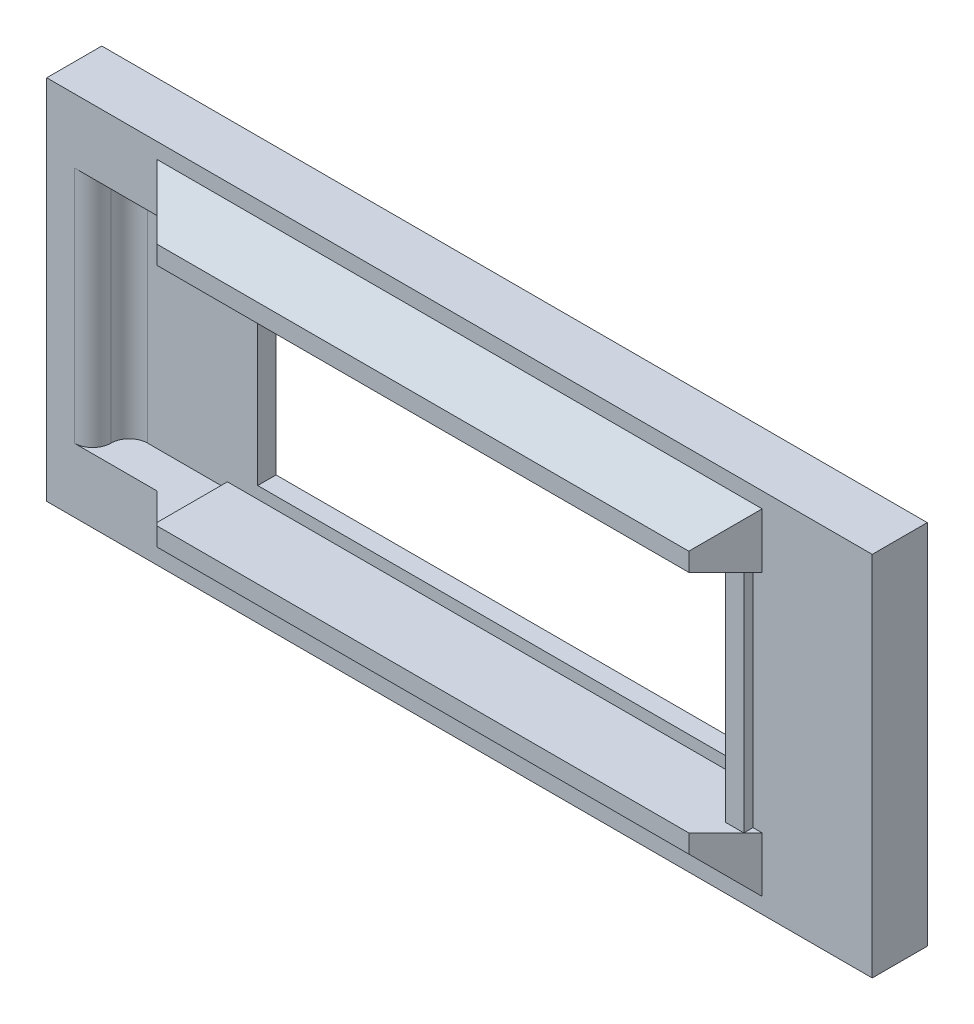
ISO-10303-21;
HEADER;
FILE_DESCRIPTION(('STEP AP214'),'2;1');
FILE_NAME('part.step','',(''),(''),'','','');
FILE_SCHEMA(('AUTOMOTIVE_DESIGN { 1 0 10303 214 1 1 1 1 }'));
ENDSEC;
DATA;
#1=APPLICATION_CONTEXT('core data for automotive mechanical design processes');
#2=APPLICATION_PROTOCOL_DEFINITION('international standard','automotive_design',2000,#1);
#3=PRODUCT_CONTEXT('',#1,'mechanical');
#4=PRODUCT('Part','Part','',(#3));
#5=PRODUCT_RELATED_PRODUCT_CATEGORY('part','',(#4));
#6=PRODUCT_DEFINITION_FORMATION('','',#4);
#7=PRODUCT_DEFINITION_CONTEXT('part definition',#1,'design');
#8=PRODUCT_DEFINITION('design','',#6,#7);
#9=PRODUCT_DEFINITION_SHAPE('','',#8);
#10=(LENGTH_UNIT() NAMED_UNIT(*) SI_UNIT(.MILLI.,.METRE.));
#11=(NAMED_UNIT(*) PLANE_ANGLE_UNIT() SI_UNIT($,.RADIAN.));
#12=(NAMED_UNIT(*) SI_UNIT($,.STERADIAN.) SOLID_ANGLE_UNIT());
#13=UNCERTAINTY_MEASURE_WITH_UNIT(LENGTH_MEASURE(1.E-05),#10,'distance_accuracy_value','');
#14=(GEOMETRIC_REPRESENTATION_CONTEXT(3) GLOBAL_UNCERTAINTY_ASSIGNED_CONTEXT((#13)) GLOBAL_UNIT_ASSIGNED_CONTEXT((#10,
#11,#12)) REPRESENTATION_CONTEXT('',''));
#15=CARTESIAN_POINT('',(0.,0.,0.));
#16=DIRECTION('',(0.,0.,1.));
#17=DIRECTION('',(1.,0.,0.));
#18=AXIS2_PLACEMENT_3D('',#15,#16,#17);
#19=CARTESIAN_POINT('',(-14.5,6.15,5.));
#20=DIRECTION('',(0.,1.,0.));
#21=DIRECTION('',(0.,0.,1.));
#22=AXIS2_PLACEMENT_3D('',#19,#20,#21);
#23=PLANE('',#22);
#24=DIRECTION('',(0.,0.,-1.));
#25=VECTOR('',#24,1.);
#26=CARTESIAN_POINT('',(15.,6.15,5.));
#27=LINE('',#26,#25);
#28=CARTESIAN_POINT('',(15.,6.15,3.5));
#29=VERTEX_POINT('',#28);
#30=CARTESIAN_POINT('',(15.,6.15,1.));
#31=VERTEX_POINT('',#30);
#32=EDGE_CURVE('E269',#29,#31,#27,.T.);
#33=ORIENTED_EDGE('',*,*,#32,.F.);
#34=DIRECTION('',(1.,0.,0.));
#35=VECTOR('',#34,1.);
#36=CARTESIAN_POINT('',(15.,6.15,3.5));
#37=LINE('',#36,#35);
#38=CARTESIAN_POINT('',(16.,6.15,3.5));
#39=VERTEX_POINT('',#38);
#40=EDGE_CURVE('E259',#29,#39,#37,.T.);
#41=ORIENTED_EDGE('',*,*,#40,.T.);
#42=DIRECTION('',(-0.707106781186548,0.,0.707106781186547));
#43=VECTOR('',#42,1.);
#44=CARTESIAN_POINT('',(0.,6.15,19.5));
#45=LINE('',#44,#43);
#46=CARTESIAN_POINT('',(14.5,6.15,5.));
#47=VERTEX_POINT('',#46);
#48=EDGE_CURVE('E266',#39,#47,#45,.T.);
#49=ORIENTED_EDGE('',*,*,#48,.T.);
#50=DIRECTION('',(1.,0.,0.));
#51=VECTOR('',#50,1.);
#52=CARTESIAN_POINT('',(-14.5,6.15,5.));
#53=LINE('',#52,#51);
#54=CARTESIAN_POINT('',(-14.5,6.15,5.));
#55=VERTEX_POINT('',#54);
#56=EDGE_CURVE('E328',#55,#47,#53,.T.);
#57=ORIENTED_EDGE('',*,*,#56,.F.);
#58=DIRECTION('',(0.707106781186551,0.,0.707106781186544));
#59=VECTOR('',#58,1.);
#60=CARTESIAN_POINT('',(-14.5,6.15,4.99999999999999));
#61=LINE('',#60,#59);
#62=CARTESIAN_POINT('',(-14.65,6.15,4.84999999999998));
#63=VERTEX_POINT('',#62);
#64=EDGE_CURVE('E458',#55,#63,#61,.F.);
#65=ORIENTED_EDGE('',*,*,#64,.T.);
#66=DIRECTION('',(0.,0.,1.));
#67=VECTOR('',#66,1.);
#68=CARTESIAN_POINT('',(-14.65,6.15,5.));
#69=LINE('',#68,#67);
#70=CARTESIAN_POINT('',(-14.65,6.15,1.));
#71=VERTEX_POINT('',#70);
#72=EDGE_CURVE('E436',#63,#71,#69,.F.);
#73=ORIENTED_EDGE('',*,*,#72,.T.);
#74=DIRECTION('',(1.,0.,0.));
#75=VECTOR('',#74,1.);
#76=CARTESIAN_POINT('',(-14.5,6.15,1.));
#77=LINE('',#76,#75);
#78=EDGE_CURVE('E320',#71,#31,#77,.T.);
#79=ORIENTED_EDGE('',*,*,#78,.T.);
#80=EDGE_LOOP('',(#33,#41,#49,#57,#65,#73,#79));
#81=FACE_BOUND('',#80,.T.);
#82=ADVANCED_FACE('F59',(#81),#23,.F.);
#83=CARTESIAN_POINT('',(0.,-6.15,5.));
#84=DIRECTION('',(0.,1.,0.));
#85=DIRECTION('',(0.,0.,1.));
#86=AXIS2_PLACEMENT_3D('',#83,#84,#85);
#87=PLANE('',#86);
#88=DIRECTION('',(1.,0.,0.));
#89=VECTOR('',#88,1.);
#90=CARTESIAN_POINT('',(15.,-6.15,3.5));
#91=LINE('',#90,#89);
#92=CARTESIAN_POINT('',(15.,-6.15,3.5));
#93=VERTEX_POINT('',#92);
#94=CARTESIAN_POINT('',(16.,-6.15,3.5));
#95=VERTEX_POINT('',#94);
#96=EDGE_CURVE('E261',#93,#95,#91,.T.);
#97=ORIENTED_EDGE('',*,*,#96,.F.);
#98=DIRECTION('',(0.,0.,1.));
#99=VECTOR('',#98,1.);
#100=CARTESIAN_POINT('',(15.,-6.15,1.));
#101=LINE('',#100,#99);
#102=CARTESIAN_POINT('',(15.,-6.15,1.));
#103=VERTEX_POINT('',#102);
#104=EDGE_CURVE('E76',#103,#93,#101,.T.);
#105=ORIENTED_EDGE('',*,*,#104,.F.);
#106=DIRECTION('',(1.,0.,0.));
#107=VECTOR('',#106,1.);
#108=CARTESIAN_POINT('',(0.,-6.15,1.));
#109=LINE('',#108,#107);
#110=CARTESIAN_POINT('',(-14.65,-6.15,1.));
#111=VERTEX_POINT('',#110);
#112=EDGE_CURVE('E84',#111,#103,#109,.T.);
#113=ORIENTED_EDGE('',*,*,#112,.F.);
#114=DIRECTION('',(0.,0.,-1.));
#115=VECTOR('',#114,1.);
#116=CARTESIAN_POINT('',(-14.65,-6.15,5.));
#117=LINE('',#116,#115);
#118=CARTESIAN_POINT('',(-14.65,-6.15,4.85000000000001));
#119=VERTEX_POINT('',#118);
#120=EDGE_CURVE('E439',#111,#119,#117,.F.);
#121=ORIENTED_EDGE('',*,*,#120,.T.);
#122=DIRECTION('',(-0.707106781186543,0.,-0.707106781186552));
#123=VECTOR('',#122,1.);
#124=CARTESIAN_POINT('',(-14.5,-6.15,5.00000000000003));
#125=LINE('',#124,#123);
#126=CARTESIAN_POINT('',(-14.5,-6.15,5.));
#127=VERTEX_POINT('',#126);
#128=EDGE_CURVE('E293',#119,#127,#125,.F.);
#129=ORIENTED_EDGE('',*,*,#128,.T.);
#130=DIRECTION('',(1.,0.,0.));
#131=VECTOR('',#130,1.);
#132=CARTESIAN_POINT('',(0.,-6.15,5.));
#133=LINE('',#132,#131);
#134=CARTESIAN_POINT('',(14.5,-6.15,5.));
#135=VERTEX_POINT('',#134);
#136=EDGE_CURVE('E322',#127,#135,#133,.T.);
#137=ORIENTED_EDGE('',*,*,#136,.T.);
#138=DIRECTION('',(0.707106781186548,0.,-0.707106781186547));
#139=VECTOR('',#138,1.);
#140=CARTESIAN_POINT('',(16.5,-6.15,3.));
#141=LINE('',#140,#139);
#142=EDGE_CURVE('E12',#135,#95,#141,.T.);
#143=ORIENTED_EDGE('',*,*,#142,.T.);
#144=EDGE_LOOP('',(#97,#105,#113,#121,#129,#137,#143));
#145=FACE_BOUND('',#144,.T.);
#146=ADVANCED_FACE('F503',(#145),#87,.T.);
#147=CARTESIAN_POINT('',(15.,-6.49999999999999,1.));
#148=DIRECTION('',(0.,-1.,0.));
#149=DIRECTION('',(1.,0.,0.));
#150=AXIS2_PLACEMENT_3D('',#147,#148,#149);
#151=PLANE('',#150);
#152=DIRECTION('',(1.,0.,0.));
#153=VECTOR('',#152,1.);
#154=CARTESIAN_POINT('',(15.,-6.49999999999999,3.));
#155=LINE('',#154,#153);
#156=CARTESIAN_POINT('',(-21.,-6.5,3.));
#157=VERTEX_POINT('',#156);
#158=CARTESIAN_POINT('',(-16.5,-6.5,3.));
#159=VERTEX_POINT('',#158);
#160=EDGE_CURVE('E334',#157,#159,#155,.T.);
#161=ORIENTED_EDGE('',*,*,#160,.T.);
#162=DIRECTION('',(-0.707106781186543,0.,-0.707106781186552));
#163=VECTOR('',#162,1.);
#164=CARTESIAN_POINT('',(-1.75000000000021,-6.5,17.75));
#165=LINE('',#164,#163);
#166=CARTESIAN_POINT('',(-15.,-6.5,4.50000000000001));
#167=VERTEX_POINT('',#166);
#168=EDGE_CURVE('E284',#159,#167,#165,.F.);
#169=ORIENTED_EDGE('',*,*,#168,.T.);
#170=DIRECTION('',(0.,0.,-1.));
#171=VECTOR('',#170,1.);
#172=CARTESIAN_POINT('',(-15.,-6.5,1.));
#173=LINE('',#172,#171);
#174=CARTESIAN_POINT('',(-15.,-6.5,1.));
#175=VERTEX_POINT('',#174);
#176=EDGE_CURVE('E433',#167,#175,#173,.T.);
#177=ORIENTED_EDGE('',*,*,#176,.T.);
#178=DIRECTION('',(1.,0.,0.));
#179=VECTOR('',#178,1.);
#180=CARTESIAN_POINT('',(15.,-6.49999999999999,1.));
#181=LINE('',#180,#179);
#182=CARTESIAN_POINT('',(-19.,-6.5,1.));
#183=VERTEX_POINT('',#182);
#184=EDGE_CURVE('E336',#183,#175,#181,.T.);
#185=ORIENTED_EDGE('',*,*,#184,.F.);
#186=CARTESIAN_POINT('',(-19.,-6.5,2.));
#187=DIRECTION('',(0.,-1.,0.));
#188=DIRECTION('',(1.,0.,0.));
#189=AXIS2_PLACEMENT_3D('',#186,#187,#188);
#190=CIRCLE('',#189,1.);
#191=CARTESIAN_POINT('',(-20.,-6.5,2.));
#192=VERTEX_POINT('',#191);
#193=EDGE_CURVE('E412',#183,#192,#190,.F.);
#194=ORIENTED_EDGE('',*,*,#193,.T.);
#195=CARTESIAN_POINT('',(-21.,-6.5,2.));
#196=DIRECTION('',(0.,-1.,0.));
#197=DIRECTION('',(1.,0.,0.));
#198=AXIS2_PLACEMENT_3D('',#195,#196,#197);
#199=CIRCLE('',#198,1.);
#200=EDGE_CURVE('E420',#192,#157,#199,.T.);
#201=ORIENTED_EDGE('',*,*,#200,.T.);
#202=EDGE_LOOP('',(#161,#169,#177,#185,#194,#201));
#203=FACE_BOUND('',#202,.T.);
#204=ADVANCED_FACE('F509',(#203),#151,.F.);
#205=CARTESIAN_POINT('',(0.,0.,3.));
#206=DIRECTION('',(0.,0.,-1.));
#207=DIRECTION('',(-1.,0.,0.));
#208=AXIS2_PLACEMENT_3D('',#205,#206,#207);
#209=PLANE('',#208);
#210=DIRECTION('',(-1.,0.,0.));
#211=VECTOR('',#210,1.);
#212=CARTESIAN_POINT('',(-14.5,6.15,3.));
#213=LINE('',#212,#211);
#214=CARTESIAN_POINT('',(16.5,6.15,3.));
#215=VERTEX_POINT('',#214);
#216=CARTESIAN_POINT('',(16.,6.15,3.));
#217=VERTEX_POINT('',#216);
#218=EDGE_CURVE('E282',#215,#217,#213,.T.);
#219=ORIENTED_EDGE('',*,*,#218,.T.);
#220=DIRECTION('',(0.,-1.,0.));
#221=VECTOR('',#220,1.);
#222=CARTESIAN_POINT('',(16.,6.15,3.));
#223=LINE('',#222,#221);
#224=CARTESIAN_POINT('',(16.,-6.15,3.));
#225=VERTEX_POINT('',#224);
#226=EDGE_CURVE('E248',#217,#225,#223,.T.);
#227=ORIENTED_EDGE('',*,*,#226,.T.);
#228=DIRECTION('',(1.,0.,0.));
#229=VECTOR('',#228,1.);
#230=CARTESIAN_POINT('',(0.,-6.15,3.));
#231=LINE('',#230,#229);
#232=CARTESIAN_POINT('',(16.5,-6.15,3.));
#233=VERTEX_POINT('',#232);
#234=EDGE_CURVE('E447',#225,#233,#231,.T.);
#235=ORIENTED_EDGE('',*,*,#234,.T.);
#236=DIRECTION('',(0.,-1.,0.));
#237=VECTOR('',#236,1.);
#238=CARTESIAN_POINT('',(16.5,0.,3.));
#239=LINE('',#238,#237);
#240=CARTESIAN_POINT('',(16.5,-9.15,3.));
#241=VERTEX_POINT('',#240);
#242=EDGE_CURVE('E443',#233,#241,#239,.T.);
#243=ORIENTED_EDGE('',*,*,#242,.T.);
#244=DIRECTION('',(-1.,0.,0.));
#245=VECTOR('',#244,1.);
#246=CARTESIAN_POINT('',(-14.5,-9.15,3.));
#247=LINE('',#246,#245);
#248=CARTESIAN_POINT('',(-16.5,-9.15,3.));
#249=VERTEX_POINT('',#248);
#250=EDGE_CURVE('E441',#241,#249,#247,.T.);
#251=ORIENTED_EDGE('',*,*,#250,.T.);
#252=DIRECTION('',(0.,1.,0.));
#253=VECTOR('',#252,1.);
#254=CARTESIAN_POINT('',(-16.5,-6.15,3.));
#255=LINE('',#254,#253);
#256=EDGE_CURVE('E445',#249,#159,#255,.T.);
#257=ORIENTED_EDGE('',*,*,#256,.T.);
#258=ORIENTED_EDGE('',*,*,#160,.F.);
#259=DIRECTION('',(0.,-1.,0.));
#260=VECTOR('',#259,1.);
#261=CARTESIAN_POINT('',(-21.,0.,3.));
#262=LINE('',#261,#260);
#263=CARTESIAN_POINT('',(-21.,6.5,3.));
#264=VERTEX_POINT('',#263);
#265=EDGE_CURVE('E417',#157,#264,#262,.F.);
#266=ORIENTED_EDGE('',*,*,#265,.T.);
#267=DIRECTION('',(-1.,0.,0.));
#268=VECTOR('',#267,1.);
#269=CARTESIAN_POINT('',(15.,6.5,3.));
#270=LINE('',#269,#268);
#271=CARTESIAN_POINT('',(-16.5,6.5,3.));
#272=VERTEX_POINT('',#271);
#273=EDGE_CURVE('E340',#272,#264,#270,.T.);
#274=ORIENTED_EDGE('',*,*,#273,.F.);
#275=DIRECTION('',(0.,1.,0.));
#276=VECTOR('',#275,1.);
#277=CARTESIAN_POINT('',(-16.5,7.15,3.));
#278=LINE('',#277,#276);
#279=CARTESIAN_POINT('',(-16.5,9.15000000000001,3.));
#280=VERTEX_POINT('',#279);
#281=EDGE_CURVE('E453',#272,#280,#278,.T.);
#282=ORIENTED_EDGE('',*,*,#281,.T.);
#283=DIRECTION('',(1.,0.,0.));
#284=VECTOR('',#283,1.);
#285=CARTESIAN_POINT('',(0.,9.15000000000001,3.));
#286=LINE('',#285,#284);
#287=CARTESIAN_POINT('',(16.5,9.15000000000001,3.));
#288=VERTEX_POINT('',#287);
#289=EDGE_CURVE('E449',#280,#288,#286,.T.);
#290=ORIENTED_EDGE('',*,*,#289,.T.);
#291=DIRECTION('',(0.,-1.,0.));
#292=VECTOR('',#291,1.);
#293=CARTESIAN_POINT('',(16.5,0.,3.));
#294=LINE('',#293,#292);
#295=EDGE_CURVE('E451',#288,#215,#294,.T.);
#296=ORIENTED_EDGE('',*,*,#295,.T.);
#297=EDGE_LOOP('',(#219,#227,#235,#243,#251,#257,#258,#266,#274,#282,#290,#296));
#298=FACE_BOUND('',#297,.T.);
#299=DIRECTION('',(0.,1.,0.));
#300=VECTOR('',#299,1.);
#301=CARTESIAN_POINT('',(22.5,-10.,3.));
#302=LINE('',#301,#300);
#303=CARTESIAN_POINT('',(22.5,-10.,3.));
#304=VERTEX_POINT('',#303);
#305=CARTESIAN_POINT('',(22.5,10.,3.));
#306=VERTEX_POINT('',#305);
#307=EDGE_CURVE('E377',#304,#306,#302,.T.);
#308=ORIENTED_EDGE('',*,*,#307,.T.);
#309=DIRECTION('',(-1.,0.,0.));
#310=VECTOR('',#309,1.);
#311=CARTESIAN_POINT('',(-22.5,10.,3.));
#312=LINE('',#311,#310);
#313=CARTESIAN_POINT('',(-22.5,10.,3.));
#314=VERTEX_POINT('',#313);
#315=EDGE_CURVE('E380',#306,#314,#312,.T.);
#316=ORIENTED_EDGE('',*,*,#315,.T.);
#317=DIRECTION('',(0.,-1.,0.));
#318=VECTOR('',#317,1.);
#319=CARTESIAN_POINT('',(-22.5,-10.,3.));
#320=LINE('',#319,#318);
#321=CARTESIAN_POINT('',(-22.5,-10.,3.));
#322=VERTEX_POINT('',#321);
#323=EDGE_CURVE('E383',#314,#322,#320,.T.);
#324=ORIENTED_EDGE('',*,*,#323,.T.);
#325=DIRECTION('',(1.,0.,0.));
#326=VECTOR('',#325,1.);
#327=CARTESIAN_POINT('',(-22.5,-10.,3.));
#328=LINE('',#327,#326);
#329=EDGE_CURVE('E385',#322,#304,#328,.T.);
#330=ORIENTED_EDGE('',*,*,#329,.T.);
#331=EDGE_LOOP('',(#308,#316,#324,#330));
#332=FACE_BOUND('',#331,.T.);
#333=ADVANCED_FACE('F473',(#298,#332),#209,.F.);
#334=CARTESIAN_POINT('',(15.,6.5,1.));
#335=DIRECTION('',(0.,1.,0.));
#336=DIRECTION('',(-1.,0.,0.));
#337=AXIS2_PLACEMENT_3D('',#334,#335,#336);
#338=PLANE('',#337);
#339=DIRECTION('',(-1.,0.,0.));
#340=VECTOR('',#339,1.);
#341=CARTESIAN_POINT('',(15.,6.5,1.));
#342=LINE('',#341,#340);
#343=CARTESIAN_POINT('',(-15.,6.5,1.));
#344=VERTEX_POINT('',#343);
#345=CARTESIAN_POINT('',(-19.,6.5,1.));
#346=VERTEX_POINT('',#345);
#347=EDGE_CURVE('E342',#344,#346,#342,.T.);
#348=ORIENTED_EDGE('',*,*,#347,.F.);
#349=DIRECTION('',(0.,0.,1.));
#350=VECTOR('',#349,1.);
#351=CARTESIAN_POINT('',(-15.,6.5,3.));
#352=LINE('',#351,#350);
#353=CARTESIAN_POINT('',(-15.,6.5,4.49999999999999));
#354=VERTEX_POINT('',#353);
#355=EDGE_CURVE('E431',#344,#354,#352,.T.);
#356=ORIENTED_EDGE('',*,*,#355,.T.);
#357=DIRECTION('',(0.707106781186551,0.,0.707106781186544));
#358=VECTOR('',#357,1.);
#359=CARTESIAN_POINT('',(-1.74999999999986,6.5,17.75));
#360=LINE('',#359,#358);
#361=EDGE_CURVE('E279',#354,#272,#360,.F.);
#362=ORIENTED_EDGE('',*,*,#361,.T.);
#363=ORIENTED_EDGE('',*,*,#273,.T.);
#364=CARTESIAN_POINT('',(-21.,6.5,2.));
#365=DIRECTION('',(0.,1.,0.));
#366=DIRECTION('',(-1.,0.,0.));
#367=AXIS2_PLACEMENT_3D('',#364,#365,#366);
#368=CIRCLE('',#367,1.);
#369=CARTESIAN_POINT('',(-20.,6.5,2.));
#370=VERTEX_POINT('',#369);
#371=EDGE_CURVE('E423',#264,#370,#368,.T.);
#372=ORIENTED_EDGE('',*,*,#371,.T.);
#373=CARTESIAN_POINT('',(-19.,6.5,2.));
#374=DIRECTION('',(0.,1.,0.));
#375=DIRECTION('',(-1.,0.,0.));
#376=AXIS2_PLACEMENT_3D('',#373,#374,#375);
#377=CIRCLE('',#376,1.);
#378=EDGE_CURVE('E414',#370,#346,#377,.F.);
#379=ORIENTED_EDGE('',*,*,#378,.T.);
#380=EDGE_LOOP('',(#348,#356,#362,#363,#372,#379));
#381=FACE_BOUND('',#380,.T.);
#382=ADVANCED_FACE('F469',(#381),#338,.F.);
#383=CARTESIAN_POINT('',(0.,0.,1.));
#384=DIRECTION('',(0.,0.,1.));
#385=DIRECTION('',(1.,0.,0.));
#386=AXIS2_PLACEMENT_3D('',#383,#384,#385);
#387=PLANE('',#386);
#388=DIRECTION('',(0.,1.,0.));
#389=VECTOR('',#388,1.);
#390=CARTESIAN_POINT('',(15.,-6.49999999999999,1.));
#391=LINE('',#390,#389);
#392=EDGE_CURVE('E339',#103,#31,#391,.T.);
#393=ORIENTED_EDGE('',*,*,#392,.T.);
#394=ORIENTED_EDGE('',*,*,#78,.F.);
#395=DIRECTION('',(0.707106781186544,-0.707106781186551,0.));
#396=VECTOR('',#395,1.);
#397=CARTESIAN_POINT('',(-4.25000000000007,-4.25000000000003,1.));
#398=LINE('',#397,#396);
#399=EDGE_CURVE('E429',#71,#344,#398,.F.);
#400=ORIENTED_EDGE('',*,*,#399,.T.);
#401=ORIENTED_EDGE('',*,*,#347,.T.);
#402=DIRECTION('',(0.,-1.,0.));
#403=VECTOR('',#402,1.);
#404=CARTESIAN_POINT('',(-19.,0.,1.));
#405=LINE('',#404,#403);
#406=EDGE_CURVE('E409',#346,#183,#405,.T.);
#407=ORIENTED_EDGE('',*,*,#406,.T.);
#408=ORIENTED_EDGE('',*,*,#184,.T.);
#409=DIRECTION('',(-0.707106781186544,-0.707106781186551,0.));
#410=VECTOR('',#409,1.);
#411=CARTESIAN_POINT('',(-4.25000000000007,4.25000000000004,1.));
#412=LINE('',#411,#410);
#413=EDGE_CURVE('E425',#175,#111,#412,.F.);
#414=ORIENTED_EDGE('',*,*,#413,.T.);
#415=ORIENTED_EDGE('',*,*,#112,.T.);
#416=EDGE_LOOP('',(#393,#394,#400,#401,#407,#408,#414,#415));
#417=FACE_BOUND('',#416,.T.);
#418=DIRECTION('',(-1.,0.,0.));
#419=VECTOR('',#418,1.);
#420=CARTESIAN_POINT('',(13.,5.5,1.));
#421=LINE('',#420,#419);
#422=CARTESIAN_POINT('',(13.,5.5,1.));
#423=VERTEX_POINT('',#422);
#424=CARTESIAN_POINT('',(-13.,5.5,1.));
#425=VERTEX_POINT('',#424);
#426=EDGE_CURVE('E406',#423,#425,#421,.T.);
#427=ORIENTED_EDGE('',*,*,#426,.F.);
#428=DIRECTION('',(0.,1.,0.));
#429=VECTOR('',#428,1.);
#430=CARTESIAN_POINT('',(13.,-5.5,1.));
#431=LINE('',#430,#429);
#432=CARTESIAN_POINT('',(13.,-5.5,1.));
#433=VERTEX_POINT('',#432);
#434=EDGE_CURVE('E344',#433,#423,#431,.T.);
#435=ORIENTED_EDGE('',*,*,#434,.F.);
#436=DIRECTION('',(1.,0.,0.));
#437=VECTOR('',#436,1.);
#438=CARTESIAN_POINT('',(13.,-5.5,1.));
#439=LINE('',#438,#437);
#440=CARTESIAN_POINT('',(-13.,-5.5,1.));
#441=VERTEX_POINT('',#440);
#442=EDGE_CURVE('E350',#441,#433,#439,.T.);
#443=ORIENTED_EDGE('',*,*,#442,.F.);
#444=DIRECTION('',(0.,-1.,0.));
#445=VECTOR('',#444,1.);
#446=CARTESIAN_POINT('',(-13.,-5.5,1.));
#447=LINE('',#446,#445);
#448=EDGE_CURVE('E353',#425,#441,#447,.T.);
#449=ORIENTED_EDGE('',*,*,#448,.F.);
#450=EDGE_LOOP('',(#427,#435,#443,#449));
#451=FACE_BOUND('',#450,.T.);
#452=ADVANCED_FACE('F518',(#417,#451),#387,.T.);
#453=CARTESIAN_POINT('',(-13.,-5.5,3.));
#454=DIRECTION('',(1.,0.,0.));
#455=DIRECTION('',(0.,0.,-1.));
#456=AXIS2_PLACEMENT_3D('',#453,#454,#455);
#457=PLANE('',#456);
#458=DIRECTION('',(0.,0.,-1.));
#459=VECTOR('',#458,1.);
#460=CARTESIAN_POINT('',(-13.,5.5,3.));
#461=LINE('',#460,#459);
#462=CARTESIAN_POINT('',(-13.,5.5,0.));
#463=VERTEX_POINT('',#462);
#464=EDGE_CURVE('E368',#425,#463,#461,.T.);
#465=ORIENTED_EDGE('',*,*,#464,.F.);
#466=ORIENTED_EDGE('',*,*,#448,.T.);
#467=DIRECTION('',(0.,0.,-1.));
#468=VECTOR('',#467,1.);
#469=CARTESIAN_POINT('',(-13.,-5.5,3.));
#470=LINE('',#469,#468);
#471=CARTESIAN_POINT('',(-13.,-5.5,0.));
#472=VERTEX_POINT('',#471);
#473=EDGE_CURVE('E374',#441,#472,#470,.T.);
#474=ORIENTED_EDGE('',*,*,#473,.T.);
#475=DIRECTION('',(0.,-1.,0.));
#476=VECTOR('',#475,1.);
#477=CARTESIAN_POINT('',(-13.,-5.5,0.));
#478=LINE('',#477,#476);
#479=EDGE_CURVE('E356',#463,#472,#478,.T.);
#480=ORIENTED_EDGE('',*,*,#479,.F.);
#481=EDGE_LOOP('',(#465,#466,#474,#480));
#482=FACE_BOUND('',#481,.T.);
#483=ADVANCED_FACE('F541',(#482),#457,.T.);
#484=CARTESIAN_POINT('',(13.,-5.5,3.));
#485=DIRECTION('',(0.,1.,0.));
#486=DIRECTION('',(-1.,0.,0.));
#487=AXIS2_PLACEMENT_3D('',#484,#485,#486);
#488=PLANE('',#487);
#489=ORIENTED_EDGE('',*,*,#473,.F.);
#490=ORIENTED_EDGE('',*,*,#442,.T.);
#491=DIRECTION('',(0.,0.,-1.));
#492=VECTOR('',#491,1.);
#493=CARTESIAN_POINT('',(13.,-5.5,3.));
#494=LINE('',#493,#492);
#495=CARTESIAN_POINT('',(13.,-5.5,0.));
#496=VERTEX_POINT('',#495);
#497=EDGE_CURVE('E372',#433,#496,#494,.T.);
#498=ORIENTED_EDGE('',*,*,#497,.T.);
#499=DIRECTION('',(1.,0.,0.));
#500=VECTOR('',#499,1.);
#501=CARTESIAN_POINT('',(13.,-5.5,0.));
#502=LINE('',#501,#500);
#503=EDGE_CURVE('E359',#472,#496,#502,.T.);
#504=ORIENTED_EDGE('',*,*,#503,.F.);
#505=EDGE_LOOP('',(#489,#490,#498,#504));
#506=FACE_BOUND('',#505,.T.);
#507=ADVANCED_FACE('F557',(#506),#488,.T.);
#508=CARTESIAN_POINT('',(13.,-5.5,3.));
#509=DIRECTION('',(-1.,0.,0.));
#510=DIRECTION('',(0.,0.,1.));
#511=AXIS2_PLACEMENT_3D('',#508,#509,#510);
#512=PLANE('',#511);
#513=ORIENTED_EDGE('',*,*,#497,.F.);
#514=ORIENTED_EDGE('',*,*,#434,.T.);
#515=DIRECTION('',(0.,0.,-1.));
#516=VECTOR('',#515,1.);
#517=CARTESIAN_POINT('',(13.,5.5,3.));
#518=LINE('',#517,#516);
#519=CARTESIAN_POINT('',(13.,5.5,0.));
#520=VERTEX_POINT('',#519);
#521=EDGE_CURVE('E370',#423,#520,#518,.T.);
#522=ORIENTED_EDGE('',*,*,#521,.T.);
#523=DIRECTION('',(0.,1.,0.));
#524=VECTOR('',#523,1.);
#525=CARTESIAN_POINT('',(13.,-5.5,0.));
#526=LINE('',#525,#524);
#527=EDGE_CURVE('E362',#496,#520,#526,.T.);
#528=ORIENTED_EDGE('',*,*,#527,.F.);
#529=EDGE_LOOP('',(#513,#514,#522,#528));
#530=FACE_BOUND('',#529,.T.);
#531=ADVANCED_FACE('F553',(#530),#512,.T.);
#532=CARTESIAN_POINT('',(13.,5.5,3.));
#533=DIRECTION('',(0.,-1.,0.));
#534=DIRECTION('',(1.,0.,0.));
#535=AXIS2_PLACEMENT_3D('',#532,#533,#534);
#536=PLANE('',#535);
#537=ORIENTED_EDGE('',*,*,#521,.F.);
#538=ORIENTED_EDGE('',*,*,#426,.T.);
#539=ORIENTED_EDGE('',*,*,#464,.T.);
#540=DIRECTION('',(-1.,0.,0.));
#541=VECTOR('',#540,1.);
#542=CARTESIAN_POINT('',(13.,5.5,0.));
#543=LINE('',#542,#541);
#544=EDGE_CURVE('E365',#520,#463,#543,.T.);
#545=ORIENTED_EDGE('',*,*,#544,.F.);
#546=EDGE_LOOP('',(#537,#538,#539,#545));
#547=FACE_BOUND('',#546,.T.);
#548=ADVANCED_FACE('F549',(#547),#536,.T.);
#549=CARTESIAN_POINT('',(0.,0.,0.));
#550=DIRECTION('',(0.,0.,-1.));
#551=DIRECTION('',(-1.,0.,0.));
#552=AXIS2_PLACEMENT_3D('',#549,#550,#551);
#553=PLANE('',#552);
#554=DIRECTION('',(0.,1.,0.));
#555=VECTOR('',#554,1.);
#556=CARTESIAN_POINT('',(22.5,-10.,0.));
#557=LINE('',#556,#555);
#558=CARTESIAN_POINT('',(22.5,-10.,0.));
#559=VERTEX_POINT('',#558);
#560=CARTESIAN_POINT('',(22.5,10.,0.));
#561=VERTEX_POINT('',#560);
#562=EDGE_CURVE('E376',#559,#561,#557,.T.);
#563=ORIENTED_EDGE('',*,*,#562,.F.);
#564=DIRECTION('',(1.,0.,0.));
#565=VECTOR('',#564,1.);
#566=CARTESIAN_POINT('',(-22.5,-10.,0.));
#567=LINE('',#566,#565);
#568=CARTESIAN_POINT('',(-22.5,-10.,0.));
#569=VERTEX_POINT('',#568);
#570=EDGE_CURVE('E381',#569,#559,#567,.T.);
#571=ORIENTED_EDGE('',*,*,#570,.F.);
#572=DIRECTION('',(0.,-1.,0.));
#573=VECTOR('',#572,1.);
#574=CARTESIAN_POINT('',(-22.5,-10.,0.));
#575=LINE('',#574,#573);
#576=CARTESIAN_POINT('',(-22.5,10.,0.));
#577=VERTEX_POINT('',#576);
#578=EDGE_CURVE('E392',#577,#569,#575,.T.);
#579=ORIENTED_EDGE('',*,*,#578,.F.);
#580=DIRECTION('',(-1.,0.,0.));
#581=VECTOR('',#580,1.);
#582=CARTESIAN_POINT('',(-22.5,10.,0.));
#583=LINE('',#582,#581);
#584=EDGE_CURVE('E390',#561,#577,#583,.T.);
#585=ORIENTED_EDGE('',*,*,#584,.F.);
#586=EDGE_LOOP('',(#563,#571,#579,#585));
#587=FACE_BOUND('',#586,.T.);
#588=ORIENTED_EDGE('',*,*,#544,.T.);
#589=ORIENTED_EDGE('',*,*,#479,.T.);
#590=ORIENTED_EDGE('',*,*,#503,.T.);
#591=ORIENTED_EDGE('',*,*,#527,.T.);
#592=EDGE_LOOP('',(#588,#589,#590,#591));
#593=FACE_BOUND('',#592,.T.);
#594=ADVANCED_FACE('F552',(#587,#593),#553,.T.);
#595=CARTESIAN_POINT('',(22.5,-10.,3.));
#596=DIRECTION('',(-1.,0.,0.));
#597=DIRECTION('',(0.,0.,1.));
#598=AXIS2_PLACEMENT_3D('',#595,#596,#597);
#599=PLANE('',#598);
#600=ORIENTED_EDGE('',*,*,#562,.T.);
#601=DIRECTION('',(0.,0.,-1.));
#602=VECTOR('',#601,1.);
#603=CARTESIAN_POINT('',(22.5,10.,3.));
#604=LINE('',#603,#602);
#605=EDGE_CURVE('E403',#306,#561,#604,.T.);
#606=ORIENTED_EDGE('',*,*,#605,.F.);
#607=ORIENTED_EDGE('',*,*,#307,.F.);
#608=DIRECTION('',(0.,0.,-1.));
#609=VECTOR('',#608,1.);
#610=CARTESIAN_POINT('',(22.5,-10.,3.));
#611=LINE('',#610,#609);
#612=EDGE_CURVE('E387',#304,#559,#611,.T.);
#613=ORIENTED_EDGE('',*,*,#612,.T.);
#614=EDGE_LOOP('',(#600,#606,#607,#613));
#615=FACE_BOUND('',#614,.T.);
#616=ADVANCED_FACE('F569',(#615),#599,.F.);
#617=CARTESIAN_POINT('',(-22.5,10.,3.));
#618=DIRECTION('',(0.,-1.,0.));
#619=DIRECTION('',(0.,0.,-1.));
#620=AXIS2_PLACEMENT_3D('',#617,#618,#619);
#621=PLANE('',#620);
#622=ORIENTED_EDGE('',*,*,#584,.T.);
#623=DIRECTION('',(0.,0.,-1.));
#624=VECTOR('',#623,1.);
#625=CARTESIAN_POINT('',(-22.5,10.,3.));
#626=LINE('',#625,#624);
#627=EDGE_CURVE('E400',#314,#577,#626,.T.);
#628=ORIENTED_EDGE('',*,*,#627,.F.);
#629=ORIENTED_EDGE('',*,*,#315,.F.);
#630=ORIENTED_EDGE('',*,*,#605,.T.);
#631=EDGE_LOOP('',(#622,#628,#629,#630));
#632=FACE_BOUND('',#631,.T.);
#633=ADVANCED_FACE('F577',(#632),#621,.F.);
#634=CARTESIAN_POINT('',(-22.5,-10.,3.));
#635=DIRECTION('',(1.,0.,0.));
#636=DIRECTION('',(0.,0.,-1.));
#637=AXIS2_PLACEMENT_3D('',#634,#635,#636);
#638=PLANE('',#637);
#639=ORIENTED_EDGE('',*,*,#578,.T.);
#640=DIRECTION('',(0.,0.,-1.));
#641=VECTOR('',#640,1.);
#642=CARTESIAN_POINT('',(-22.5,-10.,3.));
#643=LINE('',#642,#641);
#644=EDGE_CURVE('E397',#322,#569,#643,.T.);
#645=ORIENTED_EDGE('',*,*,#644,.F.);
#646=ORIENTED_EDGE('',*,*,#323,.F.);
#647=ORIENTED_EDGE('',*,*,#627,.T.);
#648=EDGE_LOOP('',(#639,#645,#646,#647));
#649=FACE_BOUND('',#648,.T.);
#650=ADVANCED_FACE('F573',(#649),#638,.F.);
#651=CARTESIAN_POINT('',(-22.5,-10.,3.));
#652=DIRECTION('',(0.,1.,0.));
#653=DIRECTION('',(0.,0.,1.));
#654=AXIS2_PLACEMENT_3D('',#651,#652,#653);
#655=PLANE('',#654);
#656=ORIENTED_EDGE('',*,*,#570,.T.);
#657=ORIENTED_EDGE('',*,*,#612,.F.);
#658=ORIENTED_EDGE('',*,*,#329,.F.);
#659=ORIENTED_EDGE('',*,*,#644,.T.);
#660=EDGE_LOOP('',(#656,#657,#658,#659));
#661=FACE_BOUND('',#660,.T.);
#662=ADVANCED_FACE('F546',(#661),#655,.F.);
#663=CARTESIAN_POINT('',(15.,-6.49999999999999,1.));
#664=DIRECTION('',(1.,0.,0.));
#665=DIRECTION('',(0.,0.,-1.));
#666=AXIS2_PLACEMENT_3D('',#663,#664,#665);
#667=PLANE('',#666);
#668=ORIENTED_EDGE('',*,*,#104,.T.);
#669=DIRECTION('',(0.,-1.,0.));
#670=VECTOR('',#669,1.);
#671=CARTESIAN_POINT('',(15.,6.15,3.5));
#672=LINE('',#671,#670);
#673=EDGE_CURVE('E253',#29,#93,#672,.T.);
#674=ORIENTED_EDGE('',*,*,#673,.F.);
#675=ORIENTED_EDGE('',*,*,#32,.T.);
#676=ORIENTED_EDGE('',*,*,#392,.F.);
#677=EDGE_LOOP('',(#668,#674,#675,#676));
#678=FACE_BOUND('',#677,.T.);
#679=ADVANCED_FACE('F531',(#678),#667,.F.);
#680=EDGE_CURVE('E276',#215,#39,#45,.T.);
#681=ORIENTED_EDGE('',*,*,#680,.T.);
#682=DIRECTION('',(0.,0.,-1.));
#683=VECTOR('',#682,1.);
#684=CARTESIAN_POINT('',(16.,6.15,3.5));
#685=LINE('',#684,#683);
#686=EDGE_CURVE('E242',#39,#217,#685,.T.);
#687=ORIENTED_EDGE('',*,*,#686,.T.);
#688=ORIENTED_EDGE('',*,*,#218,.F.);
#689=EDGE_LOOP('',(#681,#687,#688));
#690=FACE_BOUND('',#689,.T.);
#691=ADVANCED_FACE('F281',(#690),#23,.F.);
#692=CARTESIAN_POINT('',(0.,0.,5.));
#693=DIRECTION('',(0.,0.,1.));
#694=DIRECTION('',(1.,0.,0.));
#695=AXIS2_PLACEMENT_3D('',#692,#693,#694);
#696=PLANE('',#695);
#697=DIRECTION('',(0.,-1.,0.));
#698=VECTOR('',#697,1.);
#699=CARTESIAN_POINT('',(-14.5,7.15,5.));
#700=LINE('',#699,#698);
#701=CARTESIAN_POINT('',(-14.5,7.15,5.));
#702=VERTEX_POINT('',#701);
#703=EDGE_CURVE('E325',#702,#55,#700,.T.);
#704=ORIENTED_EDGE('',*,*,#703,.T.);
#705=ORIENTED_EDGE('',*,*,#56,.T.);
#706=DIRECTION('',(0.,-1.,0.));
#707=VECTOR('',#706,1.);
#708=CARTESIAN_POINT('',(14.5,7.15,5.));
#709=LINE('',#708,#707);
#710=CARTESIAN_POINT('',(14.5,7.15,5.));
#711=VERTEX_POINT('',#710);
#712=EDGE_CURVE('E278',#711,#47,#709,.T.);
#713=ORIENTED_EDGE('',*,*,#712,.F.);
#714=DIRECTION('',(1.,0.,0.));
#715=VECTOR('',#714,1.);
#716=CARTESIAN_POINT('',(-14.5,7.15,5.));
#717=LINE('',#716,#715);
#718=EDGE_CURVE('E331',#702,#711,#717,.T.);
#719=ORIENTED_EDGE('',*,*,#718,.F.);
#720=EDGE_LOOP('',(#704,#705,#713,#719));
#721=FACE_BOUND('',#720,.T.);
#722=ADVANCED_FACE('F523',(#721),#696,.T.);
#723=DIRECTION('',(0.,0.,-1.));
#724=VECTOR('',#723,1.);
#725=CARTESIAN_POINT('',(16.,-6.15,3.5));
#726=LINE('',#725,#724);
#727=EDGE_CURVE('E252',#95,#225,#726,.T.);
#728=ORIENTED_EDGE('',*,*,#727,.F.);
#729=EDGE_CURVE('E68',#95,#233,#141,.T.);
#730=ORIENTED_EDGE('',*,*,#729,.T.);
#731=ORIENTED_EDGE('',*,*,#234,.F.);
#732=EDGE_LOOP('',(#728,#730,#731));
#733=FACE_BOUND('',#732,.T.);
#734=ADVANCED_FACE('F486',(#733),#87,.T.);
#735=CARTESIAN_POINT('',(0.,0.,5.));
#736=DIRECTION('',(0.,0.,1.));
#737=DIRECTION('',(1.,0.,0.));
#738=AXIS2_PLACEMENT_3D('',#735,#736,#737);
#739=PLANE('',#738);
#740=DIRECTION('',(0.,-1.,0.));
#741=VECTOR('',#740,1.);
#742=CARTESIAN_POINT('',(14.5,-6.15,5.));
#743=LINE('',#742,#741);
#744=CARTESIAN_POINT('',(14.5,-7.15,5.));
#745=VERTEX_POINT('',#744);
#746=EDGE_CURVE('E312',#135,#745,#743,.T.);
#747=ORIENTED_EDGE('',*,*,#746,.F.);
#748=ORIENTED_EDGE('',*,*,#136,.F.);
#749=DIRECTION('',(0.,-1.,0.));
#750=VECTOR('',#749,1.);
#751=CARTESIAN_POINT('',(-14.5,-6.15,5.));
#752=LINE('',#751,#750);
#753=CARTESIAN_POINT('',(-14.5,-7.15,5.));
#754=VERTEX_POINT('',#753);
#755=EDGE_CURVE('E317',#127,#754,#752,.T.);
#756=ORIENTED_EDGE('',*,*,#755,.T.);
#757=DIRECTION('',(1.,0.,0.));
#758=VECTOR('',#757,1.);
#759=CARTESIAN_POINT('',(-14.5,-7.15,5.));
#760=LINE('',#759,#758);
#761=EDGE_CURVE('E315',#754,#745,#760,.T.);
#762=ORIENTED_EDGE('',*,*,#761,.T.);
#763=EDGE_LOOP('',(#747,#748,#756,#762));
#764=FACE_BOUND('',#763,.T.);
#765=ADVANCED_FACE('F500',(#764),#739,.T.);
#766=CARTESIAN_POINT('',(-21.,-6.5,2.));
#767=DIRECTION('',(0.,-1.,0.));
#768=DIRECTION('',(0.,0.,-1.));
#769=AXIS2_PLACEMENT_3D('',#766,#767,#768);
#770=CYLINDRICAL_SURFACE('',#769,1.);
#771=DIRECTION('',(0.,-1.,0.));
#772=VECTOR('',#771,1.);
#773=CARTESIAN_POINT('',(-20.,-6.5,2.));
#774=LINE('',#773,#772);
#775=EDGE_CURVE('E300',#370,#192,#774,.T.);
#776=ORIENTED_EDGE('',*,*,#775,.F.);
#777=ORIENTED_EDGE('',*,*,#371,.F.);
#778=ORIENTED_EDGE('',*,*,#265,.F.);
#779=ORIENTED_EDGE('',*,*,#200,.F.);
#780=EDGE_LOOP('',(#776,#777,#778,#779));
#781=FACE_BOUND('',#780,.T.);
#782=ADVANCED_FACE('F513',(#781),#770,.T.);
#783=CARTESIAN_POINT('',(-19.,0.,2.));
#784=DIRECTION('',(0.,-1.,0.));
#785=DIRECTION('',(0.,0.,-1.));
#786=AXIS2_PLACEMENT_3D('',#783,#784,#785);
#787=CYLINDRICAL_SURFACE('',#786,1.);
#788=ORIENTED_EDGE('',*,*,#378,.F.);
#789=ORIENTED_EDGE('',*,*,#775,.T.);
#790=ORIENTED_EDGE('',*,*,#193,.F.);
#791=ORIENTED_EDGE('',*,*,#406,.F.);
#792=EDGE_LOOP('',(#788,#789,#790,#791));
#793=FACE_BOUND('',#792,.T.);
#794=ADVANCED_FACE('F517',(#793),#787,.F.);
#795=CARTESIAN_POINT('',(-14.5,5.99999999999999,5.));
#796=DIRECTION('',(-0.707106781186551,-0.707106781186544,0.));
#797=DIRECTION('',(0.,0.,1.));
#798=AXIS2_PLACEMENT_3D('',#795,#796,#797);
#799=PLANE('',#798);
#800=ORIENTED_EDGE('',*,*,#72,.F.);
#801=DIRECTION('',(-0.577350269189626,0.577350269189631,-0.57735026918962));
#802=VECTOR('',#801,1.);
#803=CARTESIAN_POINT('',(-14.5,5.99999999999999,4.99999999999999));
#804=LINE('',#803,#802);
#805=EDGE_CURVE('E460',#63,#354,#804,.T.);
#806=ORIENTED_EDGE('',*,*,#805,.T.);
#807=ORIENTED_EDGE('',*,*,#355,.F.);
#808=ORIENTED_EDGE('',*,*,#399,.F.);
#809=EDGE_LOOP('',(#800,#806,#807,#808));
#810=FACE_BOUND('',#809,.T.);
#811=ADVANCED_FACE('F521',(#810),#799,.T.);
#812=CARTESIAN_POINT('',(-14.5,-5.99999999999999,5.));
#813=DIRECTION('',(-0.707106781186551,0.707106781186544,0.));
#814=DIRECTION('',(0.,0.,-1.));
#815=AXIS2_PLACEMENT_3D('',#812,#813,#814);
#816=PLANE('',#815);
#817=ORIENTED_EDGE('',*,*,#413,.F.);
#818=ORIENTED_EDGE('',*,*,#176,.F.);
#819=DIRECTION('',(0.577350269189622,0.577350269189627,0.577350269189629));
#820=VECTOR('',#819,1.);
#821=CARTESIAN_POINT('',(-14.5,-6.,5.00000000000002));
#822=LINE('',#821,#820);
#823=EDGE_CURVE('E286',#167,#119,#822,.T.);
#824=ORIENTED_EDGE('',*,*,#823,.T.);
#825=ORIENTED_EDGE('',*,*,#120,.F.);
#826=EDGE_LOOP('',(#817,#818,#824,#825));
#827=FACE_BOUND('',#826,.T.);
#828=ADVANCED_FACE('F506',(#827),#816,.T.);
#829=CARTESIAN_POINT('',(16.5,0.,3.));
#830=DIRECTION('',(-0.707106781186547,0.,-0.707106781186548));
#831=DIRECTION('',(0.,-1.,0.));
#832=AXIS2_PLACEMENT_3D('',#829,#830,#831);
#833=PLANE('',#832);
#834=ORIENTED_EDGE('',*,*,#680,.F.);
#835=ORIENTED_EDGE('',*,*,#295,.F.);
#836=DIRECTION('',(0.577350269189624,0.57735026918963,-0.577350269189624));
#837=VECTOR('',#836,1.);
#838=CARTESIAN_POINT('',(11.,3.64999999999999,8.49999999999996));
#839=LINE('',#838,#837);
#840=EDGE_CURVE('E298',#711,#288,#839,.T.);
#841=ORIENTED_EDGE('',*,*,#840,.F.);
#842=ORIENTED_EDGE('',*,*,#712,.T.);
#843=ORIENTED_EDGE('',*,*,#48,.F.);
#844=EDGE_LOOP('',(#834,#835,#841,#842,#843));
#845=FACE_BOUND('',#844,.T.);
#846=ADVANCED_FACE('F274',(#845),#833,.F.);
#847=CARTESIAN_POINT('',(0.,9.15000000000001,3.));
#848=DIRECTION('',(0.,-0.707106781186544,-0.707106781186551));
#849=DIRECTION('',(1.,0.,0.));
#850=AXIS2_PLACEMENT_3D('',#847,#848,#849);
#851=PLANE('',#850);
#852=ORIENTED_EDGE('',*,*,#840,.T.);
#853=ORIENTED_EDGE('',*,*,#289,.F.);
#854=DIRECTION('',(-0.577350269189628,0.577350269189628,-0.577350269189622));
#855=VECTOR('',#854,1.);
#856=CARTESIAN_POINT('',(-11.,3.64999999999996,8.49999999999999));
#857=LINE('',#856,#855);
#858=EDGE_CURVE('E295',#702,#280,#857,.T.);
#859=ORIENTED_EDGE('',*,*,#858,.F.);
#860=ORIENTED_EDGE('',*,*,#718,.T.);
#861=EDGE_LOOP('',(#852,#853,#859,#860));
#862=FACE_BOUND('',#861,.T.);
#863=ADVANCED_FACE('F482',(#862),#851,.F.);
#864=CARTESIAN_POINT('',(-14.5,7.15,4.99999999999999));
#865=DIRECTION('',(-0.707106781186544,0.,0.707106781186551));
#866=DIRECTION('',(0.,1.,0.));
#867=AXIS2_PLACEMENT_3D('',#864,#865,#866);
#868=PLANE('',#867);
#869=ORIENTED_EDGE('',*,*,#858,.T.);
#870=ORIENTED_EDGE('',*,*,#281,.F.);
#871=ORIENTED_EDGE('',*,*,#361,.F.);
#872=ORIENTED_EDGE('',*,*,#805,.F.);
#873=ORIENTED_EDGE('',*,*,#64,.F.);
#874=ORIENTED_EDGE('',*,*,#703,.F.);
#875=EDGE_LOOP('',(#869,#870,#871,#872,#873,#874));
#876=FACE_BOUND('',#875,.T.);
#877=ADVANCED_FACE('F478',(#876),#868,.T.);
#878=CARTESIAN_POINT('',(16.5,0.,3.));
#879=DIRECTION('',(-0.707106781186547,0.,-0.707106781186548));
#880=DIRECTION('',(0.,-1.,0.));
#881=AXIS2_PLACEMENT_3D('',#878,#879,#880);
#882=PLANE('',#881);
#883=ORIENTED_EDGE('',*,*,#142,.F.);
#884=ORIENTED_EDGE('',*,*,#746,.T.);
#885=DIRECTION('',(0.577350269189629,-0.57735026918962,-0.577350269189628));
#886=VECTOR('',#885,1.);
#887=CARTESIAN_POINT('',(4.83333333333323,2.51666666666663,14.6666666666668));
#888=LINE('',#887,#886);
#889=EDGE_CURVE('E63',#241,#745,#888,.F.);
#890=ORIENTED_EDGE('',*,*,#889,.F.);
#891=ORIENTED_EDGE('',*,*,#242,.F.);
#892=ORIENTED_EDGE('',*,*,#729,.F.);
#893=EDGE_LOOP('',(#883,#884,#890,#891,#892));
#894=FACE_BOUND('',#893,.T.);
#895=ADVANCED_FACE('F61',(#894),#882,.F.);
#896=CARTESIAN_POINT('',(-14.5,-7.15,5.00000000000002));
#897=DIRECTION('',(0.,-0.707106781186552,0.707106781186543));
#898=DIRECTION('',(-1.,0.,0.));
#899=AXIS2_PLACEMENT_3D('',#896,#897,#898);
#900=PLANE('',#899);
#901=ORIENTED_EDGE('',*,*,#889,.T.);
#902=ORIENTED_EDGE('',*,*,#761,.F.);
#903=DIRECTION('',(-0.577350269189624,-0.577350269189623,-0.577350269189631));
#904=VECTOR('',#903,1.);
#905=CARTESIAN_POINT('',(-14.5,-7.15,5.00000000000002));
#906=LINE('',#905,#904);
#907=EDGE_CURVE('E301',#249,#754,#906,.F.);
#908=ORIENTED_EDGE('',*,*,#907,.F.);
#909=ORIENTED_EDGE('',*,*,#250,.F.);
#910=EDGE_LOOP('',(#901,#902,#908,#909));
#911=FACE_BOUND('',#910,.T.);
#912=ADVANCED_FACE('F497',(#911),#900,.T.);
#913=CARTESIAN_POINT('',(-14.5,0.,5.00000000000002));
#914=DIRECTION('',(-0.707106781186552,0.,0.707106781186543));
#915=DIRECTION('',(0.,1.,0.));
#916=AXIS2_PLACEMENT_3D('',#913,#914,#915);
#917=PLANE('',#916);
#918=ORIENTED_EDGE('',*,*,#168,.F.);
#919=ORIENTED_EDGE('',*,*,#256,.F.);
#920=ORIENTED_EDGE('',*,*,#907,.T.);
#921=ORIENTED_EDGE('',*,*,#755,.F.);
#922=ORIENTED_EDGE('',*,*,#128,.F.);
#923=ORIENTED_EDGE('',*,*,#823,.F.);
#924=EDGE_LOOP('',(#918,#919,#920,#921,#922,#923));
#925=FACE_BOUND('',#924,.T.);
#926=ADVANCED_FACE('F495',(#925),#917,.T.);
#927=CARTESIAN_POINT('',(16.,6.15,3.5));
#928=DIRECTION('',(1.,0.,0.));
#929=DIRECTION('',(0.,0.,-1.));
#930=AXIS2_PLACEMENT_3D('',#927,#928,#929);
#931=PLANE('',#930);
#932=ORIENTED_EDGE('',*,*,#226,.F.);
#933=ORIENTED_EDGE('',*,*,#686,.F.);
#934=DIRECTION('',(0.,-1.,0.));
#935=VECTOR('',#934,1.);
#936=CARTESIAN_POINT('',(16.,6.15,3.5));
#937=LINE('',#936,#935);
#938=EDGE_CURVE('E245',#39,#95,#937,.T.);
#939=ORIENTED_EDGE('',*,*,#938,.T.);
#940=ORIENTED_EDGE('',*,*,#727,.T.);
#941=EDGE_LOOP('',(#932,#933,#939,#940));
#942=FACE_BOUND('',#941,.T.);
#943=ADVANCED_FACE('F244',(#942),#931,.T.);
#944=CARTESIAN_POINT('',(0.,0.,3.5));
#945=DIRECTION('',(0.,0.,-1.));
#946=DIRECTION('',(-1.,0.,0.));
#947=AXIS2_PLACEMENT_3D('',#944,#945,#946);
#948=PLANE('',#947);
#949=ORIENTED_EDGE('',*,*,#40,.F.);
#950=ORIENTED_EDGE('',*,*,#673,.T.);
#951=ORIENTED_EDGE('',*,*,#96,.T.);
#952=ORIENTED_EDGE('',*,*,#938,.F.);
#953=EDGE_LOOP('',(#949,#950,#951,#952));
#954=FACE_BOUND('',#953,.T.);
#955=ADVANCED_FACE('F258',(#954),#948,.F.);
#956=CLOSED_SHELL('',(#82,#146,#204,#333,#382,#452,#483,#507,#531,#548,#594,#616,#633,#650,#662,
#679,#691,#722,#734,#765,#782,#794,#811,#828,#846,#863,#877,#895,#912,#926,#943,#955));
#957=MANIFOLD_SOLID_BREP('B2',#956);
#958=ADVANCED_BREP_SHAPE_REPRESENTATION('',(#18,#957),#14);
#959=SHAPE_DEFINITION_REPRESENTATION(#9,#958);
ENDSEC;
END-ISO-10303-21;
